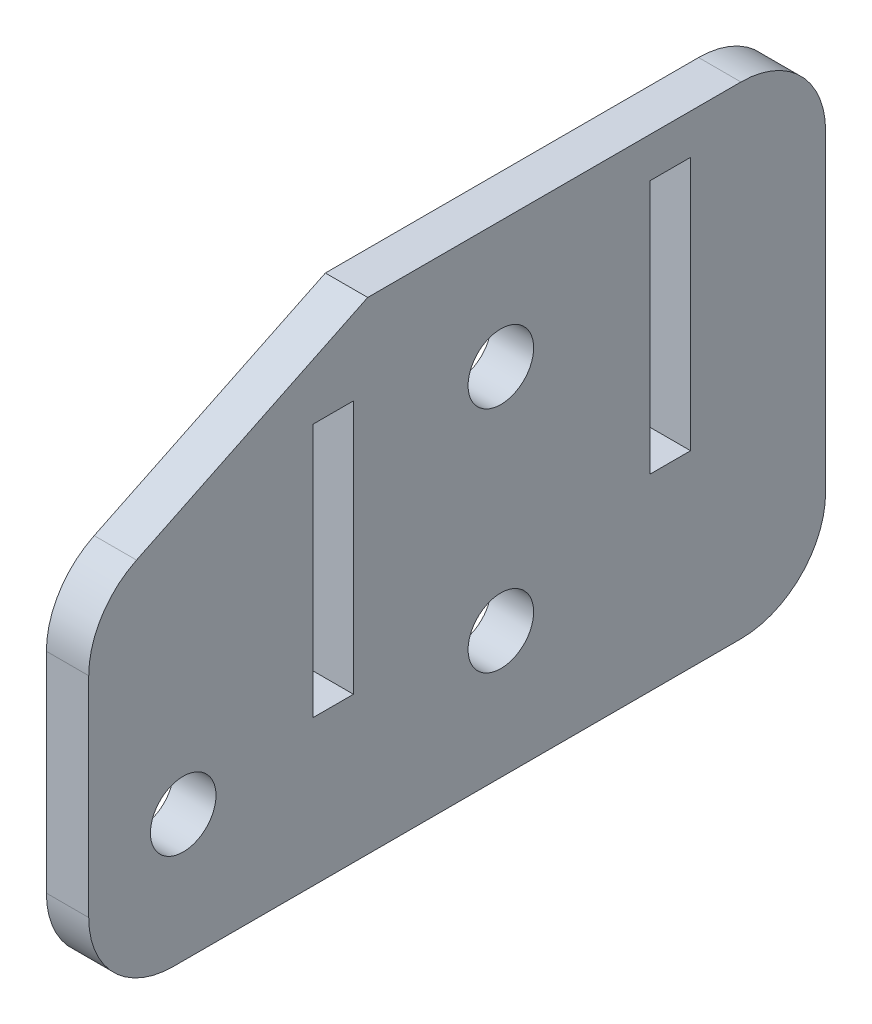
ISO-10303-21;
HEADER;
FILE_DESCRIPTION(('STEP AP214'),'2;1');
FILE_NAME('part.step','',(''),(''),'','','');
FILE_SCHEMA(('AUTOMOTIVE_DESIGN { 1 0 10303 214 1 1 1 1 }'));
ENDSEC;
DATA;
#1=APPLICATION_CONTEXT('core data for automotive mechanical design processes');
#2=APPLICATION_PROTOCOL_DEFINITION('international standard','automotive_design',2000,#1);
#3=PRODUCT_CONTEXT('',#1,'mechanical');
#4=PRODUCT('Part','Part','',(#3));
#5=PRODUCT_RELATED_PRODUCT_CATEGORY('part','',(#4));
#6=PRODUCT_DEFINITION_FORMATION('','',#4);
#7=PRODUCT_DEFINITION_CONTEXT('part definition',#1,'design');
#8=PRODUCT_DEFINITION('design','',#6,#7);
#9=PRODUCT_DEFINITION_SHAPE('','',#8);
#10=(LENGTH_UNIT() NAMED_UNIT(*) SI_UNIT(.MILLI.,.METRE.));
#11=(NAMED_UNIT(*) PLANE_ANGLE_UNIT() SI_UNIT($,.RADIAN.));
#12=(NAMED_UNIT(*) SI_UNIT($,.STERADIAN.) SOLID_ANGLE_UNIT());
#13=UNCERTAINTY_MEASURE_WITH_UNIT(LENGTH_MEASURE(1.E-05),#10,'distance_accuracy_value','');
#14=(GEOMETRIC_REPRESENTATION_CONTEXT(3) GLOBAL_UNCERTAINTY_ASSIGNED_CONTEXT((#13)) GLOBAL_UNIT_ASSIGNED_CONTEXT((#10,
#11,#12)) REPRESENTATION_CONTEXT('',''));
#15=CARTESIAN_POINT('',(0.,0.,0.));
#16=DIRECTION('',(0.,0.,1.));
#17=DIRECTION('',(1.,0.,0.));
#18=AXIS2_PLACEMENT_3D('',#15,#16,#17);
#19=CARTESIAN_POINT('',(3.175,0.,0.));
#20=DIRECTION('',(0.,1.,0.));
#21=DIRECTION('',(0.,0.,1.));
#22=AXIS2_PLACEMENT_3D('',#19,#20,#21);
#23=PLANE('',#22);
#24=DIRECTION('',(0.,0.,-1.));
#25=VECTOR('',#24,1.);
#26=CARTESIAN_POINT('',(3.175,0.,0.));
#27=LINE('',#26,#25);
#28=CARTESIAN_POINT('',(3.175,0.,-6.35));
#29=VERTEX_POINT('',#28);
#30=CARTESIAN_POINT('',(3.175,0.,-48.895));
#31=VERTEX_POINT('',#30);
#32=EDGE_CURVE('E237',#29,#31,#27,.T.);
#33=ORIENTED_EDGE('',*,*,#32,.F.);
#34=DIRECTION('',(-1.,0.,0.));
#35=VECTOR('',#34,1.);
#36=CARTESIAN_POINT('',(3.175,0.,-6.35));
#37=LINE('',#36,#35);
#38=CARTESIAN_POINT('',(0.,0.,-6.35));
#39=VERTEX_POINT('',#38);
#40=EDGE_CURVE('E289',#29,#39,#37,.T.);
#41=ORIENTED_EDGE('',*,*,#40,.T.);
#42=DIRECTION('',(0.,0.,-1.));
#43=VECTOR('',#42,1.);
#44=CARTESIAN_POINT('',(0.,0.,0.));
#45=LINE('',#44,#43);
#46=CARTESIAN_POINT('',(0.,0.,-48.895));
#47=VERTEX_POINT('',#46);
#48=EDGE_CURVE('E202',#39,#47,#45,.T.);
#49=ORIENTED_EDGE('',*,*,#48,.T.);
#50=DIRECTION('',(-1.,0.,0.));
#51=VECTOR('',#50,1.);
#52=CARTESIAN_POINT('',(3.175,0.,-48.895));
#53=LINE('',#52,#51);
#54=EDGE_CURVE('E287',#47,#31,#53,.F.);
#55=ORIENTED_EDGE('',*,*,#54,.T.);
#56=EDGE_LOOP('',(#33,#41,#49,#55));
#57=FACE_BOUND('',#56,.T.);
#58=ADVANCED_FACE('F39',(#57),#23,.F.);
#59=CARTESIAN_POINT('',(3.175,0.,-55.245));
#60=DIRECTION('',(0.,0.,1.));
#61=DIRECTION('',(1.,0.,0.));
#62=AXIS2_PLACEMENT_3D('',#59,#60,#61);
#63=PLANE('',#62);
#64=DIRECTION('',(0.,1.,0.));
#65=VECTOR('',#64,1.);
#66=CARTESIAN_POINT('',(0.,0.,-55.245));
#67=LINE('',#66,#65);
#68=CARTESIAN_POINT('',(0.,6.35,-55.245));
#69=VERTEX_POINT('',#68);
#70=CARTESIAN_POINT('',(0.,29.80436,-55.245));
#71=VERTEX_POINT('',#70);
#72=EDGE_CURVE('E254',#69,#71,#67,.T.);
#73=ORIENTED_EDGE('',*,*,#72,.T.);
#74=DIRECTION('',(-1.,0.,0.));
#75=VECTOR('',#74,1.);
#76=CARTESIAN_POINT('',(3.175,29.80436,-55.245));
#77=LINE('',#76,#75);
#78=CARTESIAN_POINT('',(3.175,29.80436,-55.245));
#79=VERTEX_POINT('',#78);
#80=EDGE_CURVE('E11',#71,#79,#77,.F.);
#81=ORIENTED_EDGE('',*,*,#80,.T.);
#82=DIRECTION('',(0.,1.,0.));
#83=VECTOR('',#82,1.);
#84=CARTESIAN_POINT('',(3.175,0.,-55.245));
#85=LINE('',#84,#83);
#86=CARTESIAN_POINT('',(3.175,6.35,-55.245));
#87=VERTEX_POINT('',#86);
#88=EDGE_CURVE('E240',#87,#79,#85,.T.);
#89=ORIENTED_EDGE('',*,*,#88,.F.);
#90=DIRECTION('',(-1.,0.,0.));
#91=VECTOR('',#90,1.);
#92=CARTESIAN_POINT('',(3.175,6.35,-55.245));
#93=LINE('',#92,#91);
#94=EDGE_CURVE('E47',#87,#69,#93,.T.);
#95=ORIENTED_EDGE('',*,*,#94,.T.);
#96=EDGE_LOOP('',(#73,#81,#89,#95));
#97=FACE_BOUND('',#96,.T.);
#98=ADVANCED_FACE('F297',(#97),#63,.F.);
#99=CARTESIAN_POINT('',(3.175,36.15436,-55.245));
#100=DIRECTION('',(0.,-1.,0.));
#101=DIRECTION('',(0.,0.,-1.));
#102=AXIS2_PLACEMENT_3D('',#99,#100,#101);
#103=PLANE('',#102);
#104=DIRECTION('',(0.,0.,1.));
#105=VECTOR('',#104,1.);
#106=CARTESIAN_POINT('',(3.175,36.15436,-55.245));
#107=LINE('',#106,#105);
#108=CARTESIAN_POINT('',(3.175,36.15436,-48.895));
#109=VERTEX_POINT('',#108);
#110=CARTESIAN_POINT('',(3.175,36.15436,-20.9147283));
#111=VERTEX_POINT('',#110);
#112=EDGE_CURVE('E243',#109,#111,#107,.T.);
#113=ORIENTED_EDGE('',*,*,#112,.F.);
#114=DIRECTION('',(-1.,0.,0.));
#115=VECTOR('',#114,1.);
#116=CARTESIAN_POINT('',(3.175,36.15436,-48.895));
#117=LINE('',#116,#115);
#118=CARTESIAN_POINT('',(0.,36.15436,-48.895));
#119=VERTEX_POINT('',#118);
#120=EDGE_CURVE('E292',#109,#119,#117,.T.);
#121=ORIENTED_EDGE('',*,*,#120,.T.);
#122=DIRECTION('',(0.,0.,1.));
#123=VECTOR('',#122,1.);
#124=CARTESIAN_POINT('',(0.,36.15436,-55.245));
#125=LINE('',#124,#123);
#126=CARTESIAN_POINT('',(0.,36.15436,-20.9147283));
#127=VERTEX_POINT('',#126);
#128=EDGE_CURVE('E256',#119,#127,#125,.T.);
#129=ORIENTED_EDGE('',*,*,#128,.T.);
#130=DIRECTION('',(-1.,0.,0.));
#131=VECTOR('',#130,1.);
#132=CARTESIAN_POINT('',(3.175,36.15436,-20.9147283));
#133=LINE('',#132,#131);
#134=EDGE_CURVE('E251',#111,#127,#133,.T.);
#135=ORIENTED_EDGE('',*,*,#134,.F.);
#136=EDGE_LOOP('',(#113,#121,#129,#135));
#137=FACE_BOUND('',#136,.T.);
#138=ADVANCED_FACE('F310',(#137),#103,.F.);
#139=CARTESIAN_POINT('',(3.175,36.15436,-20.9147283));
#140=DIRECTION('',(0.,-0.900154048389244,-0.435571680861435));
#141=DIRECTION('',(0.,0.435571680861435,-0.900154048389244));
#142=AXIS2_PLACEMENT_3D('',#139,#140,#141);
#143=PLANE('',#142);
#144=DIRECTION('',(0.,-0.435571680861435,0.900154048389244));
#145=VECTOR('',#144,1.);
#146=CARTESIAN_POINT('',(0.,36.15436,-20.9147283));
#147=LINE('',#146,#145);
#148=CARTESIAN_POINT('',(0.,27.7683262131736,-3.58411982652989));
#149=VERTEX_POINT('',#148);
#150=EDGE_CURVE('E258',#127,#149,#147,.T.);
#151=ORIENTED_EDGE('',*,*,#150,.T.);
#152=DIRECTION('',(-1.,0.,0.));
#153=VECTOR('',#152,1.);
#154=CARTESIAN_POINT('',(3.175,27.7683262131736,-3.58411982652989));
#155=LINE('',#154,#153);
#156=CARTESIAN_POINT('',(3.175,27.7683262131736,-3.58411982652989));
#157=VERTEX_POINT('',#156);
#158=EDGE_CURVE('E278',#149,#157,#155,.F.);
#159=ORIENTED_EDGE('',*,*,#158,.T.);
#160=DIRECTION('',(0.,-0.435571680861435,0.900154048389244));
#161=VECTOR('',#160,1.);
#162=CARTESIAN_POINT('',(3.175,36.15436,-20.9147283));
#163=LINE('',#162,#161);
#164=EDGE_CURVE('E245',#111,#157,#163,.T.);
#165=ORIENTED_EDGE('',*,*,#164,.F.);
#166=ORIENTED_EDGE('',*,*,#134,.T.);
#167=EDGE_LOOP('',(#151,#159,#165,#166));
#168=FACE_BOUND('',#167,.T.);
#169=ADVANCED_FACE('F444',(#168),#143,.F.);
#170=CARTESIAN_POINT('',(3.175,26.034021846,0.));
#171=DIRECTION('',(0.,0.,-1.));
#172=DIRECTION('',(-1.,0.,0.));
#173=AXIS2_PLACEMENT_3D('',#170,#171,#172);
#174=PLANE('',#173);
#175=DIRECTION('',(0.,-1.,0.));
#176=VECTOR('',#175,1.);
#177=CARTESIAN_POINT('',(3.175,26.034021846,0.));
#178=LINE('',#177,#176);
#179=CARTESIAN_POINT('',(3.175,22.0523480059019,0.));
#180=VERTEX_POINT('',#179);
#181=CARTESIAN_POINT('',(3.175,6.35,0.));
#182=VERTEX_POINT('',#181);
#183=EDGE_CURVE('E248',#180,#182,#178,.T.);
#184=ORIENTED_EDGE('',*,*,#183,.F.);
#185=DIRECTION('',(-1.,0.,0.));
#186=VECTOR('',#185,1.);
#187=CARTESIAN_POINT('',(3.175,22.0523480059019,0.));
#188=LINE('',#187,#186);
#189=CARTESIAN_POINT('',(0.,22.0523480059019,0.));
#190=VERTEX_POINT('',#189);
#191=EDGE_CURVE('E267',#180,#190,#188,.T.);
#192=ORIENTED_EDGE('',*,*,#191,.T.);
#193=DIRECTION('',(0.,-1.,0.));
#194=VECTOR('',#193,1.);
#195=CARTESIAN_POINT('',(0.,26.034021846,0.));
#196=LINE('',#195,#194);
#197=CARTESIAN_POINT('',(0.,6.35,0.));
#198=VERTEX_POINT('',#197);
#199=EDGE_CURVE('E241',#190,#198,#196,.T.);
#200=ORIENTED_EDGE('',*,*,#199,.T.);
#201=DIRECTION('',(-1.,0.,0.));
#202=VECTOR('',#201,1.);
#203=CARTESIAN_POINT('',(3.175,6.35,0.));
#204=LINE('',#203,#202);
#205=EDGE_CURVE('E265',#198,#182,#204,.F.);
#206=ORIENTED_EDGE('',*,*,#205,.T.);
#207=EDGE_LOOP('',(#184,#192,#200,#206));
#208=FACE_BOUND('',#207,.T.);
#209=ADVANCED_FACE('F321',(#208),#174,.F.);
#210=CARTESIAN_POINT('',(3.175,0.,0.));
#211=DIRECTION('',(1.,0.,0.));
#212=DIRECTION('',(0.,0.,-1.));
#213=AXIS2_PLACEMENT_3D('',#210,#211,#212);
#214=PLANE('',#213);
#215=CARTESIAN_POINT('',(3.175,9.525,-30.896153092));
#216=DIRECTION('',(1.,0.,0.));
#217=DIRECTION('',(0.,0.,-1.));
#218=AXIS2_PLACEMENT_3D('',#215,#216,#217);
#219=CIRCLE('',#218,2.45744999999999);
#220=CARTESIAN_POINT('',(3.175,9.525,-33.353603092));
#221=VERTEX_POINT('',#220);
#222=EDGE_CURVE('E540',#221,#221,#219,.T.);
#223=ORIENTED_EDGE('',*,*,#222,.F.);
#224=EDGE_LOOP('',(#223));
#225=FACE_BOUND('',#224,.T.);
#226=CARTESIAN_POINT('',(3.175,26.67,-30.896153092));
#227=DIRECTION('',(1.,0.,0.));
#228=DIRECTION('',(0.,0.,-1.));
#229=AXIS2_PLACEMENT_3D('',#226,#227,#228);
#230=CIRCLE('',#229,2.45744999999999);
#231=CARTESIAN_POINT('',(3.175,26.67,-33.353603092));
#232=VERTEX_POINT('',#231);
#233=EDGE_CURVE('E550',#232,#232,#230,.T.);
#234=ORIENTED_EDGE('',*,*,#233,.F.);
#235=EDGE_LOOP('',(#234));
#236=FACE_BOUND('',#235,.T.);
#237=CARTESIAN_POINT('',(3.175,9.525,-7.083653092));
#238=DIRECTION('',(1.,0.,0.));
#239=DIRECTION('',(0.,0.,-1.));
#240=AXIS2_PLACEMENT_3D('',#237,#238,#239);
#241=CIRCLE('',#240,2.45744999999999);
#242=CARTESIAN_POINT('',(3.175,9.525,-9.54110309199999));
#243=VERTEX_POINT('',#242);
#244=EDGE_CURVE('E189',#243,#243,#241,.T.);
#245=ORIENTED_EDGE('',*,*,#244,.F.);
#246=EDGE_LOOP('',(#245));
#247=FACE_BOUND('',#246,.T.);
#248=DIRECTION('',(0.,-1.,0.));
#249=VECTOR('',#248,1.);
#250=CARTESIAN_POINT('',(3.175,14.100208274,-45.120153092));
#251=LINE('',#250,#249);
#252=CARTESIAN_POINT('',(3.175,33.150208274,-45.120153092));
#253=VERTEX_POINT('',#252);
#254=CARTESIAN_POINT('',(3.175,14.100208274,-45.120153092));
#255=VERTEX_POINT('',#254);
#256=EDGE_CURVE('E162',#253,#255,#251,.T.);
#257=ORIENTED_EDGE('',*,*,#256,.T.);
#258=DIRECTION('',(0.,0.,1.));
#259=VECTOR('',#258,1.);
#260=CARTESIAN_POINT('',(3.175,14.100208274,-45.120153092));
#261=LINE('',#260,#259);
#262=CARTESIAN_POINT('',(3.175,14.100208274,-42.072153092));
#263=VERTEX_POINT('',#262);
#264=EDGE_CURVE('E174',#255,#263,#261,.T.);
#265=ORIENTED_EDGE('',*,*,#264,.T.);
#266=DIRECTION('',(0.,1.,0.));
#267=VECTOR('',#266,1.);
#268=CARTESIAN_POINT('',(3.175,14.100208274,-42.072153092));
#269=LINE('',#268,#267);
#270=CARTESIAN_POINT('',(3.175,33.150208274,-42.072153092));
#271=VERTEX_POINT('',#270);
#272=EDGE_CURVE('E178',#263,#271,#269,.T.);
#273=ORIENTED_EDGE('',*,*,#272,.T.);
#274=DIRECTION('',(0.,0.,-1.));
#275=VECTOR('',#274,1.);
#276=CARTESIAN_POINT('',(3.175,33.150208274,-45.120153092));
#277=LINE('',#276,#275);
#278=EDGE_CURVE('E170',#271,#253,#277,.T.);
#279=ORIENTED_EDGE('',*,*,#278,.T.);
#280=EDGE_LOOP('',(#257,#265,#273,#279));
#281=FACE_BOUND('',#280,.T.);
#282=DIRECTION('',(0.,-1.,0.));
#283=VECTOR('',#282,1.);
#284=CARTESIAN_POINT('',(3.175,10.925208274,-19.847153092));
#285=LINE('',#284,#283);
#286=CARTESIAN_POINT('',(3.175,29.975208274,-19.847153092));
#287=VERTEX_POINT('',#286);
#288=CARTESIAN_POINT('',(3.175,10.925208274,-19.847153092));
#289=VERTEX_POINT('',#288);
#290=EDGE_CURVE('E206',#287,#289,#285,.T.);
#291=ORIENTED_EDGE('',*,*,#290,.T.);
#292=DIRECTION('',(0.,0.,1.));
#293=VECTOR('',#292,1.);
#294=CARTESIAN_POINT('',(3.175,10.925208274,-19.847153092));
#295=LINE('',#294,#293);
#296=CARTESIAN_POINT('',(3.175,10.925208274,-16.799153092));
#297=VERTEX_POINT('',#296);
#298=EDGE_CURVE('E209',#289,#297,#295,.T.);
#299=ORIENTED_EDGE('',*,*,#298,.T.);
#300=DIRECTION('',(0.,1.,0.));
#301=VECTOR('',#300,1.);
#302=CARTESIAN_POINT('',(3.175,10.925208274,-16.799153092));
#303=LINE('',#302,#301);
#304=CARTESIAN_POINT('',(3.175,29.975208274,-16.799153092));
#305=VERTEX_POINT('',#304);
#306=EDGE_CURVE('E213',#297,#305,#303,.T.);
#307=ORIENTED_EDGE('',*,*,#306,.T.);
#308=DIRECTION('',(0.,0.,-1.));
#309=VECTOR('',#308,1.);
#310=CARTESIAN_POINT('',(3.175,29.975208274,-19.847153092));
#311=LINE('',#310,#309);
#312=EDGE_CURVE('E216',#305,#287,#311,.T.);
#313=ORIENTED_EDGE('',*,*,#312,.T.);
#314=EDGE_LOOP('',(#291,#299,#307,#313));
#315=FACE_BOUND('',#314,.T.);
#316=ORIENTED_EDGE('',*,*,#164,.T.);
#317=CARTESIAN_POINT('',(3.175,22.0523480059019,-6.35));
#318=DIRECTION('',(1.,0.,0.));
#319=DIRECTION('',(0.,0.,-1.));
#320=AXIS2_PLACEMENT_3D('',#317,#318,#319);
#321=CIRCLE('',#320,6.35);
#322=EDGE_CURVE('E285',#157,#180,#321,.T.);
#323=ORIENTED_EDGE('',*,*,#322,.T.);
#324=ORIENTED_EDGE('',*,*,#183,.T.);
#325=CARTESIAN_POINT('',(3.175,6.35,-6.35));
#326=DIRECTION('',(1.,0.,0.));
#327=DIRECTION('',(0.,0.,-1.));
#328=AXIS2_PLACEMENT_3D('',#325,#326,#327);
#329=CIRCLE('',#328,6.35);
#330=EDGE_CURVE('E283',#182,#29,#329,.T.);
#331=ORIENTED_EDGE('',*,*,#330,.T.);
#332=ORIENTED_EDGE('',*,*,#32,.T.);
#333=CARTESIAN_POINT('',(3.175,6.35,-48.895));
#334=DIRECTION('',(1.,0.,0.));
#335=DIRECTION('',(0.,0.,-1.));
#336=AXIS2_PLACEMENT_3D('',#333,#334,#335);
#337=CIRCLE('',#336,6.35);
#338=EDGE_CURVE('E280',#31,#87,#337,.T.);
#339=ORIENTED_EDGE('',*,*,#338,.T.);
#340=ORIENTED_EDGE('',*,*,#88,.T.);
#341=CARTESIAN_POINT('',(3.175,29.80436,-48.895));
#342=DIRECTION('',(1.,0.,0.));
#343=DIRECTION('',(0.,0.,-1.));
#344=AXIS2_PLACEMENT_3D('',#341,#342,#343);
#345=CIRCLE('',#344,6.35);
#346=EDGE_CURVE('E54',#79,#109,#345,.T.);
#347=ORIENTED_EDGE('',*,*,#346,.T.);
#348=ORIENTED_EDGE('',*,*,#112,.T.);
#349=EDGE_LOOP('',(#316,#323,#324,#331,#332,#339,#340,#347,#348));
#350=FACE_BOUND('',#349,.T.);
#351=ADVANCED_FACE('F180',(#225,#236,#247,#281,#315,#350),#214,.T.);
#352=CARTESIAN_POINT('',(0.,0.,0.));
#353=DIRECTION('',(1.,0.,0.));
#354=DIRECTION('',(0.,0.,-1.));
#355=AXIS2_PLACEMENT_3D('',#352,#353,#354);
#356=PLANE('',#355);
#357=CARTESIAN_POINT('',(0.,9.525,-30.896153092));
#358=DIRECTION('',(-1.,0.,0.));
#359=DIRECTION('',(0.,0.,1.));
#360=AXIS2_PLACEMENT_3D('',#357,#358,#359);
#361=CIRCLE('',#360,2.45744999999999);
#362=CARTESIAN_POINT('',(0.,9.525,-28.438703092));
#363=VERTEX_POINT('',#362);
#364=EDGE_CURVE('E543',#363,#363,#361,.T.);
#365=ORIENTED_EDGE('',*,*,#364,.F.);
#366=EDGE_LOOP('',(#365));
#367=FACE_BOUND('',#366,.T.);
#368=CARTESIAN_POINT('',(0.,26.67,-30.896153092));
#369=DIRECTION('',(-1.,0.,0.));
#370=DIRECTION('',(0.,0.,1.));
#371=AXIS2_PLACEMENT_3D('',#368,#369,#370);
#372=CIRCLE('',#371,2.45744999999999);
#373=CARTESIAN_POINT('',(0.,26.67,-28.438703092));
#374=VERTEX_POINT('',#373);
#375=EDGE_CURVE('E545',#374,#374,#372,.T.);
#376=ORIENTED_EDGE('',*,*,#375,.F.);
#377=EDGE_LOOP('',(#376));
#378=FACE_BOUND('',#377,.T.);
#379=CARTESIAN_POINT('',(0.,9.525,-7.083653092));
#380=DIRECTION('',(-1.,0.,0.));
#381=DIRECTION('',(0.,0.,1.));
#382=AXIS2_PLACEMENT_3D('',#379,#380,#381);
#383=CIRCLE('',#382,2.45744999999999);
#384=CARTESIAN_POINT('',(0.,9.525,-4.62620309200001));
#385=VERTEX_POINT('',#384);
#386=EDGE_CURVE('E552',#385,#385,#383,.T.);
#387=ORIENTED_EDGE('',*,*,#386,.F.);
#388=EDGE_LOOP('',(#387));
#389=FACE_BOUND('',#388,.T.);
#390=DIRECTION('',(0.,0.,1.));
#391=VECTOR('',#390,1.);
#392=CARTESIAN_POINT('',(0.,14.100208274,-45.120153092));
#393=LINE('',#392,#391);
#394=CARTESIAN_POINT('',(0.,14.100208274,-45.120153092));
#395=VERTEX_POINT('',#394);
#396=CARTESIAN_POINT('',(0.,14.100208274,-42.072153092));
#397=VERTEX_POINT('',#396);
#398=EDGE_CURVE('E195',#395,#397,#393,.T.);
#399=ORIENTED_EDGE('',*,*,#398,.F.);
#400=DIRECTION('',(0.,-1.,0.));
#401=VECTOR('',#400,1.);
#402=CARTESIAN_POINT('',(0.,14.100208274,-45.120153092));
#403=LINE('',#402,#401);
#404=CARTESIAN_POINT('',(0.,33.150208274,-45.120153092));
#405=VERTEX_POINT('',#404);
#406=EDGE_CURVE('E165',#405,#395,#403,.T.);
#407=ORIENTED_EDGE('',*,*,#406,.F.);
#408=DIRECTION('',(0.,0.,-1.));
#409=VECTOR('',#408,1.);
#410=CARTESIAN_POINT('',(0.,33.150208274,-45.120153092));
#411=LINE('',#410,#409);
#412=CARTESIAN_POINT('',(0.,33.150208274,-42.072153092));
#413=VERTEX_POINT('',#412);
#414=EDGE_CURVE('E183',#413,#405,#411,.T.);
#415=ORIENTED_EDGE('',*,*,#414,.F.);
#416=DIRECTION('',(0.,1.,0.));
#417=VECTOR('',#416,1.);
#418=CARTESIAN_POINT('',(0.,14.100208274,-42.072153092));
#419=LINE('',#418,#417);
#420=EDGE_CURVE('E186',#397,#413,#419,.T.);
#421=ORIENTED_EDGE('',*,*,#420,.F.);
#422=EDGE_LOOP('',(#399,#407,#415,#421));
#423=FACE_BOUND('',#422,.T.);
#424=DIRECTION('',(0.,0.,1.));
#425=VECTOR('',#424,1.);
#426=CARTESIAN_POINT('',(0.,10.925208274,-19.847153092));
#427=LINE('',#426,#425);
#428=CARTESIAN_POINT('',(0.,10.925208274,-19.847153092));
#429=VERTEX_POINT('',#428);
#430=CARTESIAN_POINT('',(0.,10.925208274,-16.799153092));
#431=VERTEX_POINT('',#430);
#432=EDGE_CURVE('E222',#429,#431,#427,.T.);
#433=ORIENTED_EDGE('',*,*,#432,.F.);
#434=DIRECTION('',(0.,-1.,0.));
#435=VECTOR('',#434,1.);
#436=CARTESIAN_POINT('',(0.,10.925208274,-19.847153092));
#437=LINE('',#436,#435);
#438=CARTESIAN_POINT('',(0.,29.975208274,-19.847153092));
#439=VERTEX_POINT('',#438);
#440=EDGE_CURVE('E220',#439,#429,#437,.T.);
#441=ORIENTED_EDGE('',*,*,#440,.F.);
#442=DIRECTION('',(0.,0.,-1.));
#443=VECTOR('',#442,1.);
#444=CARTESIAN_POINT('',(0.,29.975208274,-19.847153092));
#445=LINE('',#444,#443);
#446=CARTESIAN_POINT('',(0.,29.975208274,-16.799153092));
#447=VERTEX_POINT('',#446);
#448=EDGE_CURVE('E210',#447,#439,#445,.T.);
#449=ORIENTED_EDGE('',*,*,#448,.F.);
#450=DIRECTION('',(0.,1.,0.));
#451=VECTOR('',#450,1.);
#452=CARTESIAN_POINT('',(0.,10.925208274,-16.799153092));
#453=LINE('',#452,#451);
#454=EDGE_CURVE('E225',#431,#447,#453,.T.);
#455=ORIENTED_EDGE('',*,*,#454,.F.);
#456=EDGE_LOOP('',(#433,#441,#449,#455));
#457=FACE_BOUND('',#456,.T.);
#458=ORIENTED_EDGE('',*,*,#199,.F.);
#459=CARTESIAN_POINT('',(0.,22.0523480059019,-6.35));
#460=DIRECTION('',(1.,0.,0.));
#461=DIRECTION('',(0.,0.,-1.));
#462=AXIS2_PLACEMENT_3D('',#459,#460,#461);
#463=CIRCLE('',#462,6.35);
#464=EDGE_CURVE('E276',#190,#149,#463,.F.);
#465=ORIENTED_EDGE('',*,*,#464,.T.);
#466=ORIENTED_EDGE('',*,*,#150,.F.);
#467=ORIENTED_EDGE('',*,*,#128,.F.);
#468=CARTESIAN_POINT('',(0.,29.80436,-48.895));
#469=DIRECTION('',(1.,0.,0.));
#470=DIRECTION('',(0.,0.,-1.));
#471=AXIS2_PLACEMENT_3D('',#468,#469,#470);
#472=CIRCLE('',#471,6.35);
#473=EDGE_CURVE('E272',#119,#71,#472,.F.);
#474=ORIENTED_EDGE('',*,*,#473,.T.);
#475=ORIENTED_EDGE('',*,*,#72,.F.);
#476=CARTESIAN_POINT('',(0.,6.35,-48.895));
#477=DIRECTION('',(1.,0.,0.));
#478=DIRECTION('',(0.,0.,-1.));
#479=AXIS2_PLACEMENT_3D('',#476,#477,#478);
#480=CIRCLE('',#479,6.35);
#481=EDGE_CURVE('E270',#69,#47,#480,.F.);
#482=ORIENTED_EDGE('',*,*,#481,.T.);
#483=ORIENTED_EDGE('',*,*,#48,.F.);
#484=CARTESIAN_POINT('',(0.,6.35,-6.35));
#485=DIRECTION('',(1.,0.,0.));
#486=DIRECTION('',(0.,0.,-1.));
#487=AXIS2_PLACEMENT_3D('',#484,#485,#486);
#488=CIRCLE('',#487,6.35);
#489=EDGE_CURVE('E274',#39,#198,#488,.F.);
#490=ORIENTED_EDGE('',*,*,#489,.T.);
#491=EDGE_LOOP('',(#458,#465,#466,#467,#474,#475,#482,#483,#490));
#492=FACE_BOUND('',#491,.T.);
#493=ADVANCED_FACE('F302',(#367,#378,#389,#423,#457,#492),#356,.F.);
#494=CARTESIAN_POINT('',(3.175,10.925208274,-19.847153092));
#495=DIRECTION('',(0.,0.,-1.));
#496=DIRECTION('',(-1.,0.,0.));
#497=AXIS2_PLACEMENT_3D('',#494,#495,#496);
#498=PLANE('',#497);
#499=ORIENTED_EDGE('',*,*,#440,.T.);
#500=DIRECTION('',(-1.,0.,0.));
#501=VECTOR('',#500,1.);
#502=CARTESIAN_POINT('',(3.175,10.925208274,-19.847153092));
#503=LINE('',#502,#501);
#504=EDGE_CURVE('E219',#289,#429,#503,.T.);
#505=ORIENTED_EDGE('',*,*,#504,.F.);
#506=ORIENTED_EDGE('',*,*,#290,.F.);
#507=DIRECTION('',(-1.,0.,0.));
#508=VECTOR('',#507,1.);
#509=CARTESIAN_POINT('',(3.175,29.975208274,-19.847153092));
#510=LINE('',#509,#508);
#511=EDGE_CURVE('E196',#287,#439,#510,.T.);
#512=ORIENTED_EDGE('',*,*,#511,.T.);
#513=EDGE_LOOP('',(#499,#505,#506,#512));
#514=FACE_BOUND('',#513,.T.);
#515=ADVANCED_FACE('F384',(#514),#498,.F.);
#516=CARTESIAN_POINT('',(3.175,29.975208274,-19.847153092));
#517=DIRECTION('',(0.,1.,0.));
#518=DIRECTION('',(0.,0.,1.));
#519=AXIS2_PLACEMENT_3D('',#516,#517,#518);
#520=PLANE('',#519);
#521=ORIENTED_EDGE('',*,*,#448,.T.);
#522=ORIENTED_EDGE('',*,*,#511,.F.);
#523=ORIENTED_EDGE('',*,*,#312,.F.);
#524=DIRECTION('',(-1.,0.,0.));
#525=VECTOR('',#524,1.);
#526=CARTESIAN_POINT('',(3.175,29.975208274,-16.799153092));
#527=LINE('',#526,#525);
#528=EDGE_CURVE('E231',#305,#447,#527,.T.);
#529=ORIENTED_EDGE('',*,*,#528,.T.);
#530=EDGE_LOOP('',(#521,#522,#523,#529));
#531=FACE_BOUND('',#530,.T.);
#532=ADVANCED_FACE('F430',(#531),#520,.F.);
#533=CARTESIAN_POINT('',(3.175,10.925208274,-16.799153092));
#534=DIRECTION('',(0.,0.,1.));
#535=DIRECTION('',(1.,0.,0.));
#536=AXIS2_PLACEMENT_3D('',#533,#534,#535);
#537=PLANE('',#536);
#538=ORIENTED_EDGE('',*,*,#454,.T.);
#539=ORIENTED_EDGE('',*,*,#528,.F.);
#540=ORIENTED_EDGE('',*,*,#306,.F.);
#541=DIRECTION('',(-1.,0.,0.));
#542=VECTOR('',#541,1.);
#543=CARTESIAN_POINT('',(3.175,10.925208274,-16.799153092));
#544=LINE('',#543,#542);
#545=EDGE_CURVE('E233',#297,#431,#544,.T.);
#546=ORIENTED_EDGE('',*,*,#545,.T.);
#547=EDGE_LOOP('',(#538,#539,#540,#546));
#548=FACE_BOUND('',#547,.T.);
#549=ADVANCED_FACE('F433',(#548),#537,.F.);
#550=CARTESIAN_POINT('',(3.175,10.925208274,-19.847153092));
#551=DIRECTION('',(0.,-1.,0.));
#552=DIRECTION('',(0.,0.,-1.));
#553=AXIS2_PLACEMENT_3D('',#550,#551,#552);
#554=PLANE('',#553);
#555=ORIENTED_EDGE('',*,*,#432,.T.);
#556=ORIENTED_EDGE('',*,*,#545,.F.);
#557=ORIENTED_EDGE('',*,*,#298,.F.);
#558=ORIENTED_EDGE('',*,*,#504,.T.);
#559=EDGE_LOOP('',(#555,#556,#557,#558));
#560=FACE_BOUND('',#559,.T.);
#561=ADVANCED_FACE('F429',(#560),#554,.F.);
#562=CARTESIAN_POINT('',(3.175,14.100208274,-45.120153092));
#563=DIRECTION('',(0.,0.,-1.));
#564=DIRECTION('',(-1.,0.,0.));
#565=AXIS2_PLACEMENT_3D('',#562,#563,#564);
#566=PLANE('',#565);
#567=ORIENTED_EDGE('',*,*,#406,.T.);
#568=DIRECTION('',(-1.,0.,0.));
#569=VECTOR('',#568,1.);
#570=CARTESIAN_POINT('',(3.175,14.100208274,-45.120153092));
#571=LINE('',#570,#569);
#572=EDGE_CURVE('E158',#255,#395,#571,.T.);
#573=ORIENTED_EDGE('',*,*,#572,.F.);
#574=ORIENTED_EDGE('',*,*,#256,.F.);
#575=DIRECTION('',(-1.,0.,0.));
#576=VECTOR('',#575,1.);
#577=CARTESIAN_POINT('',(3.175,33.150208274,-45.120153092));
#578=LINE('',#577,#576);
#579=EDGE_CURVE('E200',#253,#405,#578,.T.);
#580=ORIENTED_EDGE('',*,*,#579,.T.);
#581=EDGE_LOOP('',(#567,#573,#574,#580));
#582=FACE_BOUND('',#581,.T.);
#583=ADVANCED_FACE('F160',(#582),#566,.F.);
#584=CARTESIAN_POINT('',(3.175,33.150208274,-45.120153092));
#585=DIRECTION('',(0.,1.,0.));
#586=DIRECTION('',(0.,0.,1.));
#587=AXIS2_PLACEMENT_3D('',#584,#585,#586);
#588=PLANE('',#587);
#589=ORIENTED_EDGE('',*,*,#414,.T.);
#590=ORIENTED_EDGE('',*,*,#579,.F.);
#591=ORIENTED_EDGE('',*,*,#278,.F.);
#592=DIRECTION('',(-1.,0.,0.));
#593=VECTOR('',#592,1.);
#594=CARTESIAN_POINT('',(3.175,33.150208274,-42.072153092));
#595=LINE('',#594,#593);
#596=EDGE_CURVE('E203',#271,#413,#595,.T.);
#597=ORIENTED_EDGE('',*,*,#596,.T.);
#598=EDGE_LOOP('',(#589,#590,#591,#597));
#599=FACE_BOUND('',#598,.T.);
#600=ADVANCED_FACE('F418',(#599),#588,.F.);
#601=CARTESIAN_POINT('',(3.175,14.100208274,-42.072153092));
#602=DIRECTION('',(0.,0.,1.));
#603=DIRECTION('',(1.,0.,0.));
#604=AXIS2_PLACEMENT_3D('',#601,#602,#603);
#605=PLANE('',#604);
#606=ORIENTED_EDGE('',*,*,#420,.T.);
#607=ORIENTED_EDGE('',*,*,#596,.F.);
#608=ORIENTED_EDGE('',*,*,#272,.F.);
#609=DIRECTION('',(-1.,0.,0.));
#610=VECTOR('',#609,1.);
#611=CARTESIAN_POINT('',(3.175,14.100208274,-42.072153092));
#612=LINE('',#611,#610);
#613=EDGE_CURVE('E169',#263,#397,#612,.T.);
#614=ORIENTED_EDGE('',*,*,#613,.T.);
#615=EDGE_LOOP('',(#606,#607,#608,#614));
#616=FACE_BOUND('',#615,.T.);
#617=ADVANCED_FACE('F421',(#616),#605,.F.);
#618=CARTESIAN_POINT('',(3.175,14.100208274,-45.120153092));
#619=DIRECTION('',(0.,-1.,0.));
#620=DIRECTION('',(0.,0.,-1.));
#621=AXIS2_PLACEMENT_3D('',#618,#619,#620);
#622=PLANE('',#621);
#623=ORIENTED_EDGE('',*,*,#398,.T.);
#624=ORIENTED_EDGE('',*,*,#613,.F.);
#625=ORIENTED_EDGE('',*,*,#264,.F.);
#626=ORIENTED_EDGE('',*,*,#572,.T.);
#627=EDGE_LOOP('',(#623,#624,#625,#626));
#628=FACE_BOUND('',#627,.T.);
#629=ADVANCED_FACE('F175',(#628),#622,.F.);
#630=CARTESIAN_POINT('',(3.175,22.0523480059019,-6.35));
#631=DIRECTION('',(-1.,0.,0.));
#632=DIRECTION('',(0.,0.,1.));
#633=AXIS2_PLACEMENT_3D('',#630,#631,#632);
#634=CYLINDRICAL_SURFACE('',#633,6.35);
#635=ORIENTED_EDGE('',*,*,#322,.F.);
#636=ORIENTED_EDGE('',*,*,#158,.F.);
#637=ORIENTED_EDGE('',*,*,#464,.F.);
#638=ORIENTED_EDGE('',*,*,#191,.F.);
#639=EDGE_LOOP('',(#635,#636,#637,#638));
#640=FACE_BOUND('',#639,.T.);
#641=ADVANCED_FACE('F319',(#640),#634,.T.);
#642=CARTESIAN_POINT('',(3.175,6.35,-6.35));
#643=DIRECTION('',(-1.,0.,0.));
#644=DIRECTION('',(0.,0.,1.));
#645=AXIS2_PLACEMENT_3D('',#642,#643,#644);
#646=CYLINDRICAL_SURFACE('',#645,6.35);
#647=ORIENTED_EDGE('',*,*,#330,.F.);
#648=ORIENTED_EDGE('',*,*,#205,.F.);
#649=ORIENTED_EDGE('',*,*,#489,.F.);
#650=ORIENTED_EDGE('',*,*,#40,.F.);
#651=EDGE_LOOP('',(#647,#648,#649,#650));
#652=FACE_BOUND('',#651,.T.);
#653=ADVANCED_FACE('F326',(#652),#646,.T.);
#654=CARTESIAN_POINT('',(3.175,29.80436,-48.895));
#655=DIRECTION('',(-1.,0.,0.));
#656=DIRECTION('',(0.,0.,1.));
#657=AXIS2_PLACEMENT_3D('',#654,#655,#656);
#658=CYLINDRICAL_SURFACE('',#657,6.35);
#659=ORIENTED_EDGE('',*,*,#346,.F.);
#660=ORIENTED_EDGE('',*,*,#80,.F.);
#661=ORIENTED_EDGE('',*,*,#473,.F.);
#662=ORIENTED_EDGE('',*,*,#120,.F.);
#663=EDGE_LOOP('',(#659,#660,#661,#662));
#664=FACE_BOUND('',#663,.T.);
#665=ADVANCED_FACE('F308',(#664),#658,.T.);
#666=CARTESIAN_POINT('',(3.175,6.35,-48.895));
#667=DIRECTION('',(-1.,0.,0.));
#668=DIRECTION('',(0.,0.,1.));
#669=AXIS2_PLACEMENT_3D('',#666,#667,#668);
#670=CYLINDRICAL_SURFACE('',#669,6.35);
#671=ORIENTED_EDGE('',*,*,#338,.F.);
#672=ORIENTED_EDGE('',*,*,#54,.F.);
#673=ORIENTED_EDGE('',*,*,#481,.F.);
#674=ORIENTED_EDGE('',*,*,#94,.F.);
#675=EDGE_LOOP('',(#671,#672,#673,#674));
#676=FACE_BOUND('',#675,.T.);
#677=ADVANCED_FACE('F41',(#676),#670,.T.);
#678=CARTESIAN_POINT('',(0.,9.525,-7.083653092));
#679=DIRECTION('',(-1.,0.,0.));
#680=DIRECTION('',(0.,0.,1.));
#681=AXIS2_PLACEMENT_3D('',#678,#679,#680);
#682=CYLINDRICAL_SURFACE('',#681,2.45744999999999);
#683=ORIENTED_EDGE('',*,*,#244,.T.);
#684=EDGE_LOOP('',(#683));
#685=FACE_BOUND('',#684,.T.);
#686=ORIENTED_EDGE('',*,*,#386,.T.);
#687=EDGE_LOOP('',(#686));
#688=FACE_BOUND('',#687,.T.);
#689=ADVANCED_FACE('F331',(#685,#688),#682,.F.);
#690=CARTESIAN_POINT('',(0.,26.67,-30.896153092));
#691=DIRECTION('',(-1.,0.,0.));
#692=DIRECTION('',(0.,0.,1.));
#693=AXIS2_PLACEMENT_3D('',#690,#691,#692);
#694=CYLINDRICAL_SURFACE('',#693,2.45744999999999);
#695=ORIENTED_EDGE('',*,*,#233,.T.);
#696=EDGE_LOOP('',(#695));
#697=FACE_BOUND('',#696,.T.);
#698=ORIENTED_EDGE('',*,*,#375,.T.);
#699=EDGE_LOOP('',(#698));
#700=FACE_BOUND('',#699,.T.);
#701=ADVANCED_FACE('F336',(#697,#700),#694,.F.);
#702=CARTESIAN_POINT('',(0.,9.525,-30.896153092));
#703=DIRECTION('',(-1.,0.,0.));
#704=DIRECTION('',(0.,0.,1.));
#705=AXIS2_PLACEMENT_3D('',#702,#703,#704);
#706=CYLINDRICAL_SURFACE('',#705,2.45744999999999);
#707=ORIENTED_EDGE('',*,*,#222,.T.);
#708=EDGE_LOOP('',(#707));
#709=FACE_BOUND('',#708,.T.);
#710=ORIENTED_EDGE('',*,*,#364,.T.);
#711=EDGE_LOOP('',(#710));
#712=FACE_BOUND('',#711,.T.);
#713=ADVANCED_FACE('F401',(#709,#712),#706,.F.);
#714=CLOSED_SHELL('',(#58,#98,#138,#169,#209,#351,#493,#515,#532,#549,#561,#583,#600,#617,#629,
#641,#653,#665,#677,#689,#701,#713));
#715=MANIFOLD_SOLID_BREP('B2',#714);
#716=ADVANCED_BREP_SHAPE_REPRESENTATION('',(#18,#715),#14);
#717=SHAPE_DEFINITION_REPRESENTATION(#9,#716);
ENDSEC;
END-ISO-10303-21;
